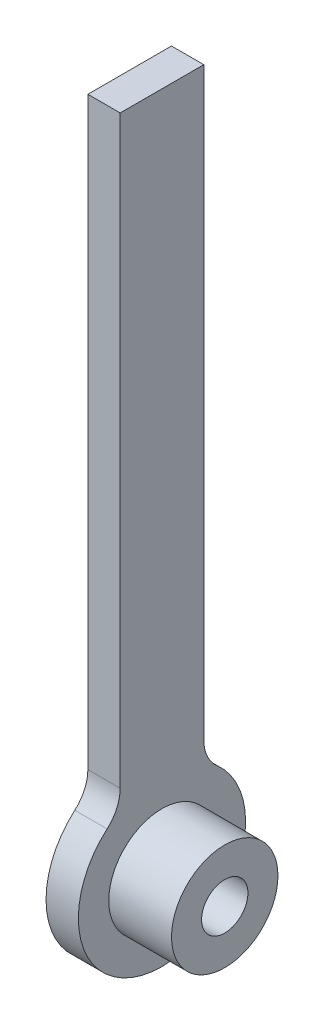
ISO-10303-21;
HEADER;
FILE_DESCRIPTION(('STEP AP214'),'2;1');
FILE_NAME('part.step','',(''),(''),'','','');
FILE_SCHEMA(('AUTOMOTIVE_DESIGN { 1 0 10303 214 1 1 1 1 }'));
ENDSEC;
DATA;
#1=APPLICATION_CONTEXT('core data for automotive mechanical design processes');
#2=APPLICATION_PROTOCOL_DEFINITION('international standard','automotive_design',2000,#1);
#3=PRODUCT_CONTEXT('',#1,'mechanical');
#4=PRODUCT('Part','Part','',(#3));
#5=PRODUCT_RELATED_PRODUCT_CATEGORY('part','',(#4));
#6=PRODUCT_DEFINITION_FORMATION('','',#4);
#7=PRODUCT_DEFINITION_CONTEXT('part definition',#1,'design');
#8=PRODUCT_DEFINITION('design','',#6,#7);
#9=PRODUCT_DEFINITION_SHAPE('','',#8);
#10=(LENGTH_UNIT() NAMED_UNIT(*) SI_UNIT(.MILLI.,.METRE.));
#11=(NAMED_UNIT(*) PLANE_ANGLE_UNIT() SI_UNIT($,.RADIAN.));
#12=(NAMED_UNIT(*) SI_UNIT($,.STERADIAN.) SOLID_ANGLE_UNIT());
#13=UNCERTAINTY_MEASURE_WITH_UNIT(LENGTH_MEASURE(1.E-05),#10,'distance_accuracy_value','');
#14=(GEOMETRIC_REPRESENTATION_CONTEXT(3) GLOBAL_UNCERTAINTY_ASSIGNED_CONTEXT((#13)) GLOBAL_UNIT_ASSIGNED_CONTEXT((#10,
#11,#12)) REPRESENTATION_CONTEXT('',''));
#15=CARTESIAN_POINT('',(0.,0.,0.));
#16=DIRECTION('',(0.,0.,1.));
#17=DIRECTION('',(1.,0.,0.));
#18=AXIS2_PLACEMENT_3D('',#15,#16,#17);
#19=CARTESIAN_POINT('',(8.5,200.,0.));
#20=DIRECTION('',(0.,-1.,0.));
#21=DIRECTION('',(0.,0.,-1.));
#22=AXIS2_PLACEMENT_3D('',#19,#20,#21);
#23=PLANE('',#22);
#24=DIRECTION('',(1.,0.,0.));
#25=VECTOR('',#24,1.);
#26=CARTESIAN_POINT('',(-1.5,200.,-33.));
#27=LINE('',#26,#25);
#28=CARTESIAN_POINT('',(0.,200.,-33.));
#29=VERTEX_POINT('',#28);
#30=CARTESIAN_POINT('',(8.5,200.,-33.));
#31=VERTEX_POINT('',#30);
#32=EDGE_CURVE('E124',#29,#31,#27,.T.);
#33=ORIENTED_EDGE('',*,*,#32,.F.);
#34=DIRECTION('',(0.,0.,1.));
#35=VECTOR('',#34,1.);
#36=CARTESIAN_POINT('',(0.,200.,0.));
#37=LINE('',#36,#35);
#38=CARTESIAN_POINT('',(0.,200.,-11.));
#39=VERTEX_POINT('',#38);
#40=EDGE_CURVE('E140',#29,#39,#37,.T.);
#41=ORIENTED_EDGE('',*,*,#40,.T.);
#42=DIRECTION('',(1.,0.,0.));
#43=VECTOR('',#42,1.);
#44=CARTESIAN_POINT('',(-1.5,200.,-11.));
#45=LINE('',#44,#43);
#46=CARTESIAN_POINT('',(8.5,200.,-11.));
#47=VERTEX_POINT('',#46);
#48=EDGE_CURVE('E52',#39,#47,#45,.T.);
#49=ORIENTED_EDGE('',*,*,#48,.T.);
#50=DIRECTION('',(0.,0.,1.));
#51=VECTOR('',#50,1.);
#52=CARTESIAN_POINT('',(8.5,200.,0.));
#53=LINE('',#52,#51);
#54=EDGE_CURVE('E110',#31,#47,#53,.T.);
#55=ORIENTED_EDGE('',*,*,#54,.F.);
#56=EDGE_LOOP('',(#33,#41,#49,#55));
#57=FACE_BOUND('',#56,.T.);
#58=ADVANCED_FACE('F38',(#57),#23,.F.);
#59=CARTESIAN_POINT('',(8.5,0.,0.));
#60=DIRECTION('',(-1.,0.,0.));
#61=DIRECTION('',(0.,0.,1.));
#62=AXIS2_PLACEMENT_3D('',#59,#60,#61);
#63=PLANE('',#62);
#64=CARTESIAN_POINT('',(8.5,22.,-22.));
#65=DIRECTION('',(-1.,0.,0.));
#66=DIRECTION('',(0.,0.,1.));
#67=AXIS2_PLACEMENT_3D('',#64,#65,#66);
#68=CIRCLE('',#67,14.);
#69=CARTESIAN_POINT('',(8.5,22.,-8.));
#70=VERTEX_POINT('',#69);
#71=EDGE_CURVE('E13',#70,#70,#68,.F.);
#72=ORIENTED_EDGE('',*,*,#71,.F.);
#73=EDGE_LOOP('',(#72));
#74=FACE_BOUND('',#73,.T.);
#75=DIRECTION('',(0.,1.,0.));
#76=VECTOR('',#75,1.);
#77=CARTESIAN_POINT('',(8.5,200.,-33.));
#78=LINE('',#77,#76);
#79=CARTESIAN_POINT('',(8.5,46.1453929352993,-33.));
#80=VERTEX_POINT('',#79);
#81=EDGE_CURVE('E122',#80,#31,#78,.T.);
#82=ORIENTED_EDGE('',*,*,#81,.T.);
#83=ORIENTED_EDGE('',*,*,#54,.T.);
#84=DIRECTION('',(0.,-1.,0.));
#85=VECTOR('',#84,1.);
#86=CARTESIAN_POINT('',(8.5,200.,-11.));
#87=LINE('',#86,#85);
#88=CARTESIAN_POINT('',(8.5,46.1453929352992,-11.));
#89=VERTEX_POINT('',#88);
#90=EDGE_CURVE('E92',#47,#89,#87,.T.);
#91=ORIENTED_EDGE('',*,*,#90,.T.);
#92=CARTESIAN_POINT('',(8.5,46.1453929352992,-0.999999999999977));
#93=DIRECTION('',(-1.,0.,0.));
#94=DIRECTION('',(0.,0.,1.));
#95=AXIS2_PLACEMENT_3D('',#92,#93,#94);
#96=CIRCLE('',#95,10.);
#97=CARTESIAN_POINT('',(8.5,38.5999576430182,-7.56249999999998));
#98=VERTEX_POINT('',#97);
#99=EDGE_CURVE('E99',#89,#98,#96,.T.);
#100=ORIENTED_EDGE('',*,*,#99,.T.);
#101=CARTESIAN_POINT('',(8.5,22.,-22.));
#102=DIRECTION('',(1.,0.,0.));
#103=DIRECTION('',(0.,0.,-1.));
#104=AXIS2_PLACEMENT_3D('',#101,#102,#103);
#105=CIRCLE('',#104,22.);
#106=CARTESIAN_POINT('',(8.5,38.5999576430182,-36.4375));
#107=VERTEX_POINT('',#106);
#108=EDGE_CURVE('E104',#98,#107,#105,.T.);
#109=ORIENTED_EDGE('',*,*,#108,.T.);
#110=CARTESIAN_POINT('',(8.5,46.1453929352993,-43.));
#111=DIRECTION('',(-1.,0.,0.));
#112=DIRECTION('',(0.,0.,-1.));
#113=AXIS2_PLACEMENT_3D('',#110,#111,#112);
#114=CIRCLE('',#113,10.);
#115=EDGE_CURVE('E119',#107,#80,#114,.T.);
#116=ORIENTED_EDGE('',*,*,#115,.T.);
#117=EDGE_LOOP('',(#82,#83,#91,#100,#109,#116));
#118=FACE_BOUND('',#117,.T.);
#119=ADVANCED_FACE('F108',(#74,#118),#63,.F.);
#120=CARTESIAN_POINT('',(0.,0.,0.));
#121=DIRECTION('',(-1.,0.,0.));
#122=DIRECTION('',(0.,0.,1.));
#123=AXIS2_PLACEMENT_3D('',#120,#121,#122);
#124=PLANE('',#123);
#125=CARTESIAN_POINT('',(0.,22.,-22.));
#126=DIRECTION('',(1.,0.,0.));
#127=DIRECTION('',(0.,0.,-1.));
#128=AXIS2_PLACEMENT_3D('',#125,#126,#127);
#129=CIRCLE('',#128,11.04);
#130=CARTESIAN_POINT('',(0.,22.,-33.04));
#131=VERTEX_POINT('',#130);
#132=EDGE_CURVE('E134',#131,#131,#129,.T.);
#133=ORIENTED_EDGE('',*,*,#132,.T.);
#134=EDGE_LOOP('',(#133));
#135=FACE_BOUND('',#134,.T.);
#136=ORIENTED_EDGE('',*,*,#40,.F.);
#137=DIRECTION('',(0.,-1.,0.));
#138=VECTOR('',#137,1.);
#139=CARTESIAN_POINT('',(0.,0.,-33.));
#140=LINE('',#139,#138);
#141=CARTESIAN_POINT('',(0.,46.1453929352993,-33.));
#142=VERTEX_POINT('',#141);
#143=EDGE_CURVE('E45',#29,#142,#140,.T.);
#144=ORIENTED_EDGE('',*,*,#143,.T.);
#145=CARTESIAN_POINT('',(0.,46.1453929352993,-43.));
#146=DIRECTION('',(-1.,0.,0.));
#147=DIRECTION('',(0.,0.,1.));
#148=AXIS2_PLACEMENT_3D('',#145,#146,#147);
#149=CIRCLE('',#148,10.);
#150=CARTESIAN_POINT('',(0.,38.5999576430182,-36.4375));
#151=VERTEX_POINT('',#150);
#152=EDGE_CURVE('E152',#142,#151,#149,.F.);
#153=ORIENTED_EDGE('',*,*,#152,.T.);
#154=CARTESIAN_POINT('',(0.,22.,-22.));
#155=DIRECTION('',(-1.,0.,0.));
#156=DIRECTION('',(0.,0.,1.));
#157=AXIS2_PLACEMENT_3D('',#154,#155,#156);
#158=CIRCLE('',#157,22.);
#159=CARTESIAN_POINT('',(0.,38.5999576430182,-7.56249999999998));
#160=VERTEX_POINT('',#159);
#161=EDGE_CURVE('E149',#151,#160,#158,.T.);
#162=ORIENTED_EDGE('',*,*,#161,.T.);
#163=CARTESIAN_POINT('',(0.,46.1453929352992,-0.999999999999977));
#164=DIRECTION('',(-1.,0.,0.));
#165=DIRECTION('',(0.,0.,1.));
#166=AXIS2_PLACEMENT_3D('',#163,#164,#165);
#167=CIRCLE('',#166,10.);
#168=CARTESIAN_POINT('',(0.,46.1453929352992,-11.));
#169=VERTEX_POINT('',#168);
#170=EDGE_CURVE('E147',#160,#169,#167,.F.);
#171=ORIENTED_EDGE('',*,*,#170,.T.);
#172=DIRECTION('',(0.,1.,0.));
#173=VECTOR('',#172,1.);
#174=CARTESIAN_POINT('',(0.,0.,-11.));
#175=LINE('',#174,#173);
#176=EDGE_CURVE('E93',#169,#39,#175,.T.);
#177=ORIENTED_EDGE('',*,*,#176,.T.);
#178=EDGE_LOOP('',(#136,#144,#153,#162,#171,#177));
#179=FACE_BOUND('',#178,.T.);
#180=ADVANCED_FACE('F156',(#135,#179),#124,.T.);
#181=CARTESIAN_POINT('',(39.7258354571979,22.,-22.));
#182=DIRECTION('',(-1.,0.,0.));
#183=DIRECTION('',(0.,0.,1.));
#184=AXIS2_PLACEMENT_3D('',#181,#182,#183);
#185=CYLINDRICAL_SURFACE('',#184,11.04);
#186=CARTESIAN_POINT('',(7.5,22.,-22.));
#187=DIRECTION('',(-1.,0.,0.));
#188=DIRECTION('',(0.,0.,1.));
#189=AXIS2_PLACEMENT_3D('',#186,#187,#188);
#190=CIRCLE('',#189,11.04);
#191=CARTESIAN_POINT('',(7.5,22.,-10.96));
#192=VERTEX_POINT('',#191);
#193=EDGE_CURVE('E137',#192,#192,#190,.T.);
#194=ORIENTED_EDGE('',*,*,#193,.F.);
#195=EDGE_LOOP('',(#194));
#196=FACE_BOUND('',#195,.T.);
#197=ORIENTED_EDGE('',*,*,#132,.F.);
#198=EDGE_LOOP('',(#197));
#199=FACE_BOUND('',#198,.T.);
#200=ADVANCED_FACE('F188',(#196,#199),#185,.F.);
#201=CARTESIAN_POINT('',(7.5,0.,0.));
#202=DIRECTION('',(-1.,0.,0.));
#203=DIRECTION('',(0.,0.,1.));
#204=AXIS2_PLACEMENT_3D('',#201,#202,#203);
#205=PLANE('',#204);
#206=CARTESIAN_POINT('',(7.5,22.,-22.));
#207=DIRECTION('',(-1.,0.,0.));
#208=DIRECTION('',(0.,0.,1.));
#209=AXIS2_PLACEMENT_3D('',#206,#207,#208);
#210=CIRCLE('',#209,8.);
#211=CARTESIAN_POINT('',(7.5,22.,-14.));
#212=VERTEX_POINT('',#211);
#213=EDGE_CURVE('E126',#212,#212,#210,.T.);
#214=ORIENTED_EDGE('',*,*,#213,.F.);
#215=EDGE_LOOP('',(#214));
#216=FACE_BOUND('',#215,.T.);
#217=ORIENTED_EDGE('',*,*,#193,.T.);
#218=EDGE_LOOP('',(#217));
#219=FACE_BOUND('',#218,.T.);
#220=ADVANCED_FACE('F174',(#216,#219),#205,.T.);
#221=CARTESIAN_POINT('',(-1.5,22.,-22.));
#222=DIRECTION('',(1.,0.,0.));
#223=DIRECTION('',(0.,0.,-1.));
#224=AXIS2_PLACEMENT_3D('',#221,#222,#223);
#225=CYLINDRICAL_SURFACE('',#224,8.);
#226=ORIENTED_EDGE('',*,*,#213,.T.);
#227=EDGE_LOOP('',(#226));
#228=FACE_BOUND('',#227,.T.);
#229=CARTESIAN_POINT('',(8.5,22.,-22.));
#230=DIRECTION('',(1.,0.,0.));
#231=DIRECTION('',(0.,0.,-1.));
#232=AXIS2_PLACEMENT_3D('',#229,#230,#231);
#233=CIRCLE('',#232,8.);
#234=CARTESIAN_POINT('',(8.5,22.,-30.));
#235=VERTEX_POINT('',#234);
#236=EDGE_CURVE('E111',#235,#235,#233,.F.);
#237=ORIENTED_EDGE('',*,*,#236,.F.);
#238=EDGE_LOOP('',(#237));
#239=FACE_BOUND('',#238,.T.);
#240=ADVANCED_FACE('F167',(#228,#239),#225,.F.);
#241=CARTESIAN_POINT('',(-1.5,22.,-22.));
#242=DIRECTION('',(1.,0.,0.));
#243=DIRECTION('',(0.,0.,-1.));
#244=AXIS2_PLACEMENT_3D('',#241,#242,#243);
#245=CYLINDRICAL_SURFACE('',#244,22.);
#246=ORIENTED_EDGE('',*,*,#161,.F.);
#247=DIRECTION('',(1.,0.,0.));
#248=VECTOR('',#247,1.);
#249=CARTESIAN_POINT('',(-1.5,38.5999576430182,-36.4375));
#250=LINE('',#249,#248);
#251=EDGE_CURVE('E129',#151,#107,#250,.T.);
#252=ORIENTED_EDGE('',*,*,#251,.T.);
#253=ORIENTED_EDGE('',*,*,#108,.F.);
#254=DIRECTION('',(1.,0.,0.));
#255=VECTOR('',#254,1.);
#256=CARTESIAN_POINT('',(-1.5,38.5999576430182,-7.56249999999998));
#257=LINE('',#256,#255);
#258=EDGE_CURVE('E96',#160,#98,#257,.T.);
#259=ORIENTED_EDGE('',*,*,#258,.F.);
#260=EDGE_LOOP('',(#246,#252,#253,#259));
#261=FACE_BOUND('',#260,.T.);
#262=ADVANCED_FACE('F165',(#261),#245,.T.);
#263=CARTESIAN_POINT('',(-1.5,200.,-33.));
#264=DIRECTION('',(0.,0.,-1.));
#265=DIRECTION('',(0.,1.,0.));
#266=AXIS2_PLACEMENT_3D('',#263,#264,#265);
#267=PLANE('',#266);
#268=ORIENTED_EDGE('',*,*,#32,.T.);
#269=ORIENTED_EDGE('',*,*,#81,.F.);
#270=DIRECTION('',(1.,0.,0.));
#271=VECTOR('',#270,1.);
#272=CARTESIAN_POINT('',(-1.5,46.1453929352993,-33.));
#273=LINE('',#272,#271);
#274=EDGE_CURVE('E127',#142,#80,#273,.T.);
#275=ORIENTED_EDGE('',*,*,#274,.F.);
#276=ORIENTED_EDGE('',*,*,#143,.F.);
#277=EDGE_LOOP('',(#268,#269,#275,#276));
#278=FACE_BOUND('',#277,.T.);
#279=ADVANCED_FACE('F159',(#278),#267,.T.);
#280=CARTESIAN_POINT('',(-1.5,46.1453929352993,-43.));
#281=DIRECTION('',(1.,0.,0.));
#282=DIRECTION('',(0.,0.,-1.));
#283=AXIS2_PLACEMENT_3D('',#280,#281,#282);
#284=CYLINDRICAL_SURFACE('',#283,10.);
#285=ORIENTED_EDGE('',*,*,#274,.T.);
#286=ORIENTED_EDGE('',*,*,#115,.F.);
#287=ORIENTED_EDGE('',*,*,#251,.F.);
#288=ORIENTED_EDGE('',*,*,#152,.F.);
#289=EDGE_LOOP('',(#285,#286,#287,#288));
#290=FACE_BOUND('',#289,.T.);
#291=ADVANCED_FACE('F163',(#290),#284,.F.);
#292=CARTESIAN_POINT('',(-1.5,46.1453929352992,-0.999999999999977));
#293=DIRECTION('',(1.,0.,0.));
#294=DIRECTION('',(0.,0.,-1.));
#295=AXIS2_PLACEMENT_3D('',#292,#293,#294);
#296=CYLINDRICAL_SURFACE('',#295,10.);
#297=ORIENTED_EDGE('',*,*,#258,.T.);
#298=ORIENTED_EDGE('',*,*,#99,.F.);
#299=DIRECTION('',(1.,0.,0.));
#300=VECTOR('',#299,1.);
#301=CARTESIAN_POINT('',(-1.5,46.1453929352992,-11.));
#302=LINE('',#301,#300);
#303=EDGE_CURVE('E88',#169,#89,#302,.T.);
#304=ORIENTED_EDGE('',*,*,#303,.F.);
#305=ORIENTED_EDGE('',*,*,#170,.F.);
#306=EDGE_LOOP('',(#297,#298,#304,#305));
#307=FACE_BOUND('',#306,.T.);
#308=ADVANCED_FACE('F100',(#307),#296,.F.);
#309=CARTESIAN_POINT('',(-1.5,200.,-11.));
#310=DIRECTION('',(0.,0.,1.));
#311=DIRECTION('',(0.,-1.,0.));
#312=AXIS2_PLACEMENT_3D('',#309,#310,#311);
#313=PLANE('',#312);
#314=ORIENTED_EDGE('',*,*,#303,.T.);
#315=ORIENTED_EDGE('',*,*,#90,.F.);
#316=ORIENTED_EDGE('',*,*,#48,.F.);
#317=ORIENTED_EDGE('',*,*,#176,.F.);
#318=EDGE_LOOP('',(#314,#315,#316,#317));
#319=FACE_BOUND('',#318,.T.);
#320=ADVANCED_FACE('F90',(#319),#313,.T.);
#321=CARTESIAN_POINT('',(8.5,22.,-22.));
#322=DIRECTION('',(1.,0.,0.));
#323=DIRECTION('',(0.,0.,-1.));
#324=AXIS2_PLACEMENT_3D('',#321,#322,#323);
#325=PLANE('',#324);
#326=CARTESIAN_POINT('',(8.5,22.,-22.));
#327=DIRECTION('',(1.,0.,0.));
#328=DIRECTION('',(0.,0.,-1.));
#329=AXIS2_PLACEMENT_3D('',#326,#327,#328);
#330=CIRCLE('',#329,6.096);
#331=CARTESIAN_POINT('',(8.5,22.,-28.096));
#332=VERTEX_POINT('',#331);
#333=EDGE_CURVE('E226',#332,#332,#330,.T.);
#334=ORIENTED_EDGE('',*,*,#333,.T.);
#335=EDGE_LOOP('',(#334));
#336=FACE_BOUND('',#335,.T.);
#337=ORIENTED_EDGE('',*,*,#236,.T.);
#338=EDGE_LOOP('',(#337));
#339=FACE_BOUND('',#338,.T.);
#340=ADVANCED_FACE('F199',(#336,#339),#325,.F.);
#341=CARTESIAN_POINT('',(25.01,22.,-22.));
#342=DIRECTION('',(-1.,0.,0.));
#343=DIRECTION('',(0.,0.,1.));
#344=AXIS2_PLACEMENT_3D('',#341,#342,#343);
#345=CYLINDRICAL_SURFACE('',#344,14.);
#346=CARTESIAN_POINT('',(25.01,22.,-22.));
#347=DIRECTION('',(1.,0.,0.));
#348=DIRECTION('',(0.,0.,-1.));
#349=AXIS2_PLACEMENT_3D('',#346,#347,#348);
#350=CIRCLE('',#349,14.);
#351=CARTESIAN_POINT('',(25.01,22.,-36.));
#352=VERTEX_POINT('',#351);
#353=EDGE_CURVE('E114',#352,#352,#350,.T.);
#354=ORIENTED_EDGE('',*,*,#353,.F.);
#355=EDGE_LOOP('',(#354));
#356=FACE_BOUND('',#355,.T.);
#357=ORIENTED_EDGE('',*,*,#71,.T.);
#358=EDGE_LOOP('',(#357));
#359=FACE_BOUND('',#358,.T.);
#360=ADVANCED_FACE('F207',(#356,#359),#345,.T.);
#361=CARTESIAN_POINT('',(25.01,22.,-22.));
#362=DIRECTION('',(1.,0.,0.));
#363=DIRECTION('',(0.,0.,-1.));
#364=AXIS2_PLACEMENT_3D('',#361,#362,#363);
#365=PLANE('',#364);
#366=CARTESIAN_POINT('',(25.01,22.,-22.));
#367=DIRECTION('',(1.,0.,0.));
#368=DIRECTION('',(0.,0.,-1.));
#369=AXIS2_PLACEMENT_3D('',#366,#367,#368);
#370=CIRCLE('',#369,6.096);
#371=CARTESIAN_POINT('',(25.01,22.,-28.096));
#372=VERTEX_POINT('',#371);
#373=EDGE_CURVE('E229',#372,#372,#370,.T.);
#374=ORIENTED_EDGE('',*,*,#373,.F.);
#375=EDGE_LOOP('',(#374));
#376=FACE_BOUND('',#375,.T.);
#377=ORIENTED_EDGE('',*,*,#353,.T.);
#378=EDGE_LOOP('',(#377));
#379=FACE_BOUND('',#378,.T.);
#380=ADVANCED_FACE('F210',(#376,#379),#365,.T.);
#381=CARTESIAN_POINT('',(8.5,22.,-22.));
#382=DIRECTION('',(1.,0.,0.));
#383=DIRECTION('',(0.,0.,-1.));
#384=AXIS2_PLACEMENT_3D('',#381,#382,#383);
#385=CYLINDRICAL_SURFACE('',#384,6.096);
#386=ORIENTED_EDGE('',*,*,#333,.F.);
#387=EDGE_LOOP('',(#386));
#388=FACE_BOUND('',#387,.T.);
#389=ORIENTED_EDGE('',*,*,#373,.T.);
#390=EDGE_LOOP('',(#389));
#391=FACE_BOUND('',#390,.T.);
#392=ADVANCED_FACE('F217',(#388,#391),#385,.F.);
#393=CLOSED_SHELL('',(#58,#119,#180,#200,#220,#240,#262,#279,#291,#308,#320,#340,#360,#380,#392));
#394=MANIFOLD_SOLID_BREP('B2',#393);
#395=ADVANCED_BREP_SHAPE_REPRESENTATION('',(#18,#394),#14);
#396=SHAPE_DEFINITION_REPRESENTATION(#9,#395);
ENDSEC;
END-ISO-10303-21;
